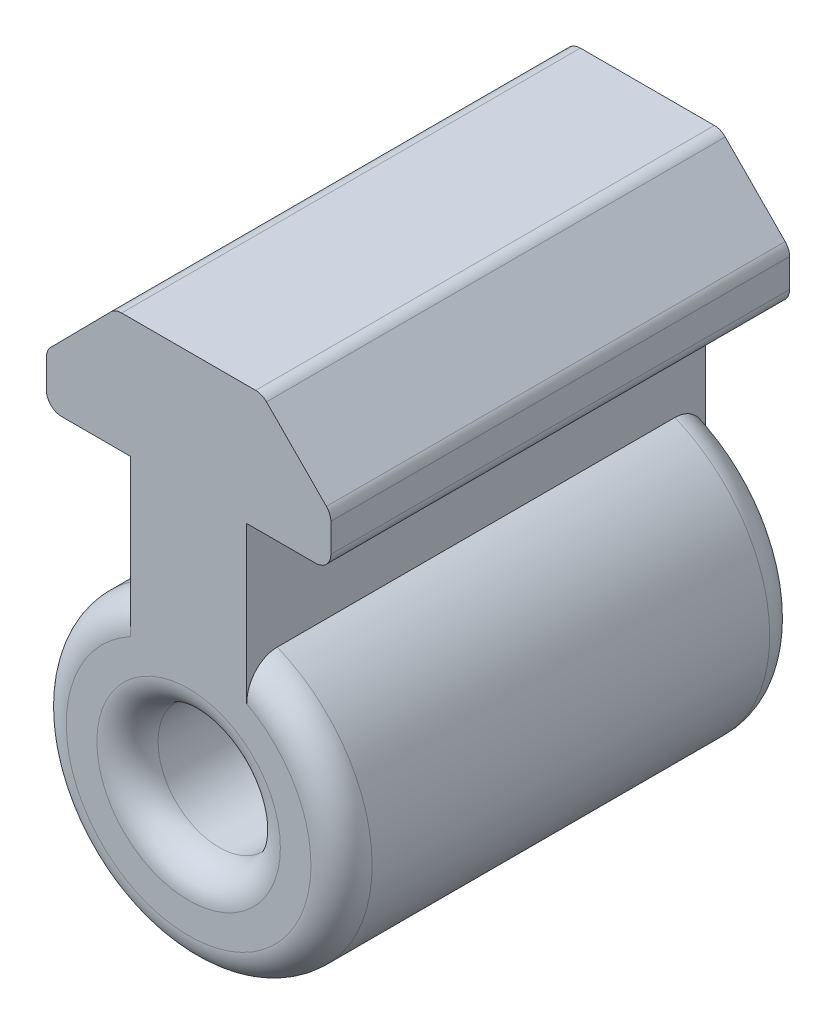
ISO-10303-21;
HEADER;
FILE_DESCRIPTION(('STEP AP214'),'2;1');
FILE_NAME('part.step','',(''),(''),'','','');
FILE_SCHEMA(('AUTOMOTIVE_DESIGN { 1 0 10303 214 1 1 1 1 }'));
ENDSEC;
DATA;
#1=APPLICATION_CONTEXT('core data for automotive mechanical design processes');
#2=APPLICATION_PROTOCOL_DEFINITION('international standard','automotive_design',2000,#1);
#3=PRODUCT_CONTEXT('',#1,'mechanical');
#4=PRODUCT('Part','Part','',(#3));
#5=PRODUCT_RELATED_PRODUCT_CATEGORY('part','',(#4));
#6=PRODUCT_DEFINITION_FORMATION('','',#4);
#7=PRODUCT_DEFINITION_CONTEXT('part definition',#1,'design');
#8=PRODUCT_DEFINITION('design','',#6,#7);
#9=PRODUCT_DEFINITION_SHAPE('','',#8);
#10=(LENGTH_UNIT() NAMED_UNIT(*) SI_UNIT(.MILLI.,.METRE.));
#11=(NAMED_UNIT(*) PLANE_ANGLE_UNIT() SI_UNIT($,.RADIAN.));
#12=(NAMED_UNIT(*) SI_UNIT($,.STERADIAN.) SOLID_ANGLE_UNIT());
#13=UNCERTAINTY_MEASURE_WITH_UNIT(LENGTH_MEASURE(1.E-05),#10,'distance_accuracy_value','');
#14=(GEOMETRIC_REPRESENTATION_CONTEXT(3) GLOBAL_UNCERTAINTY_ASSIGNED_CONTEXT((#13)) GLOBAL_UNIT_ASSIGNED_CONTEXT((#10,
#11,#12)) REPRESENTATION_CONTEXT('',''));
#15=CARTESIAN_POINT('',(0.,0.,0.));
#16=DIRECTION('',(0.,0.,1.));
#17=DIRECTION('',(1.,0.,0.));
#18=AXIS2_PLACEMENT_3D('',#15,#16,#17);
#19=CARTESIAN_POINT('',(9.3,11.28,30.));
#20=DIRECTION('',(-0.711066265811422,-0.703125,0.));
#21=DIRECTION('',(0.703125,-0.711066265811422,0.));
#22=AXIS2_PLACEMENT_3D('',#19,#20,#21);
#23=PLANE('',#22);
#24=DIRECTION('',(-0.703125,0.711066265811422,0.));
#25=VECTOR('',#24,1.);
#26=CARTESIAN_POINT('',(9.3,11.28,30.));
#27=LINE('',#26,#25);
#28=CARTESIAN_POINT('',(9.01106626581142,11.5721970224874,30.));
#29=VERTEX_POINT('',#28);
#30=CARTESIAN_POINT('',(5.09355946753683,15.5339491011931,30.));
#31=VERTEX_POINT('',#30);
#32=EDGE_CURVE('E221',#29,#31,#27,.T.);
#33=ORIENTED_EDGE('',*,*,#32,.F.);
#34=DIRECTION('',(0.,0.,-1.));
#35=VECTOR('',#34,1.);
#36=CARTESIAN_POINT('',(9.01106626581142,11.5721970224874,30.));
#37=LINE('',#36,#35);
#38=CARTESIAN_POINT('',(9.01106626581142,11.5721970224874,0.));
#39=VERTEX_POINT('',#38);
#40=EDGE_CURVE('E272',#29,#39,#37,.T.);
#41=ORIENTED_EDGE('',*,*,#40,.T.);
#42=DIRECTION('',(-0.703125,0.711066265811422,0.));
#43=VECTOR('',#42,1.);
#44=CARTESIAN_POINT('',(9.3,11.28,0.));
#45=LINE('',#44,#43);
#46=CARTESIAN_POINT('',(5.09355946753683,15.5339491011931,0.));
#47=VERTEX_POINT('',#46);
#48=EDGE_CURVE('E198',#39,#47,#45,.T.);
#49=ORIENTED_EDGE('',*,*,#48,.T.);
#50=DIRECTION('',(0.,0.,-1.));
#51=VECTOR('',#50,1.);
#52=CARTESIAN_POINT('',(5.09355946753683,15.5339491011931,30.));
#53=LINE('',#52,#51);
#54=EDGE_CURVE('E270',#47,#31,#53,.F.);
#55=ORIENTED_EDGE('',*,*,#54,.T.);
#56=EDGE_LOOP('',(#33,#41,#49,#55));
#57=FACE_BOUND('',#56,.T.);
#58=ADVANCED_FACE('F33',(#57),#23,.F.);
#59=CARTESIAN_POINT('',(-4.8,15.8308241011931,30.));
#60=DIRECTION('',(0.,-1.,0.));
#61=DIRECTION('',(0.,0.,-1.));
#62=AXIS2_PLACEMENT_3D('',#59,#60,#61);
#63=PLANE('',#62);
#64=DIRECTION('',(-1.,0.,0.));
#65=VECTOR('',#64,1.);
#66=CARTESIAN_POINT('',(-4.8,15.8308241011931,0.));
#67=LINE('',#66,#65);
#68=CARTESIAN_POINT('',(4.3824932017254,15.8308241011931,0.));
#69=VERTEX_POINT('',#68);
#70=CARTESIAN_POINT('',(-4.3824932017254,15.8308241011931,0.));
#71=VERTEX_POINT('',#70);
#72=EDGE_CURVE('E201',#69,#71,#67,.T.);
#73=ORIENTED_EDGE('',*,*,#72,.T.);
#74=DIRECTION('',(0.,0.,-1.));
#75=VECTOR('',#74,1.);
#76=CARTESIAN_POINT('',(-4.3824932017254,15.8308241011931,30.));
#77=LINE('',#76,#75);
#78=CARTESIAN_POINT('',(-4.3824932017254,15.8308241011931,30.));
#79=VERTEX_POINT('',#78);
#80=EDGE_CURVE('E278',#71,#79,#77,.F.);
#81=ORIENTED_EDGE('',*,*,#80,.T.);
#82=DIRECTION('',(-1.,0.,0.));
#83=VECTOR('',#82,1.);
#84=CARTESIAN_POINT('',(-4.8,15.8308241011931,30.));
#85=LINE('',#84,#83);
#86=CARTESIAN_POINT('',(4.3824932017254,15.8308241011931,30.));
#87=VERTEX_POINT('',#86);
#88=EDGE_CURVE('E408',#87,#79,#85,.T.);
#89=ORIENTED_EDGE('',*,*,#88,.F.);
#90=DIRECTION('',(0.,0.,-1.));
#91=VECTOR('',#90,1.);
#92=CARTESIAN_POINT('',(4.3824932017254,15.8308241011931,30.));
#93=LINE('',#92,#91);
#94=EDGE_CURVE('E275',#87,#69,#93,.T.);
#95=ORIENTED_EDGE('',*,*,#94,.T.);
#96=EDGE_LOOP('',(#73,#81,#89,#95));
#97=FACE_BOUND('',#96,.T.);
#98=ADVANCED_FACE('F366',(#97),#63,.F.);
#99=CARTESIAN_POINT('',(-9.3,11.28,30.));
#100=DIRECTION('',(0.711066265811422,-0.703125,0.));
#101=DIRECTION('',(0.703125,0.711066265811422,0.));
#102=AXIS2_PLACEMENT_3D('',#99,#100,#101);
#103=PLANE('',#102);
#104=DIRECTION('',(-0.703125,-0.711066265811422,0.));
#105=VECTOR('',#104,1.);
#106=CARTESIAN_POINT('',(-9.3,11.28,0.));
#107=LINE('',#106,#105);
#108=CARTESIAN_POINT('',(-5.09355946753682,15.5339491011931,0.));
#109=VERTEX_POINT('',#108);
#110=CARTESIAN_POINT('',(-9.01106626581142,11.5721970224874,0.));
#111=VERTEX_POINT('',#110);
#112=EDGE_CURVE('E204',#109,#111,#107,.T.);
#113=ORIENTED_EDGE('',*,*,#112,.T.);
#114=DIRECTION('',(0.,0.,-1.));
#115=VECTOR('',#114,1.);
#116=CARTESIAN_POINT('',(-9.01106626581142,11.5721970224874,30.));
#117=LINE('',#116,#115);
#118=CARTESIAN_POINT('',(-9.01106626581142,11.5721970224874,30.));
#119=VERTEX_POINT('',#118);
#120=EDGE_CURVE('E268',#111,#119,#117,.F.);
#121=ORIENTED_EDGE('',*,*,#120,.T.);
#122=DIRECTION('',(-0.703125,-0.711066265811422,0.));
#123=VECTOR('',#122,1.);
#124=CARTESIAN_POINT('',(-9.3,11.28,30.));
#125=LINE('',#124,#123);
#126=CARTESIAN_POINT('',(-5.09355946753682,15.5339491011931,30.));
#127=VERTEX_POINT('',#126);
#128=EDGE_CURVE('E405',#127,#119,#125,.T.);
#129=ORIENTED_EDGE('',*,*,#128,.F.);
#130=DIRECTION('',(0.,0.,-1.));
#131=VECTOR('',#130,1.);
#132=CARTESIAN_POINT('',(-5.09355946753683,15.5339491011931,30.));
#133=LINE('',#132,#131);
#134=EDGE_CURVE('E265',#127,#109,#133,.T.);
#135=ORIENTED_EDGE('',*,*,#134,.T.);
#136=EDGE_LOOP('',(#113,#121,#129,#135));
#137=FACE_BOUND('',#136,.T.);
#138=ADVANCED_FACE('F372',(#137),#103,.F.);
#139=CARTESIAN_POINT('',(-9.3,8.,30.));
#140=DIRECTION('',(1.,0.,0.));
#141=DIRECTION('',(0.,0.,-1.));
#142=AXIS2_PLACEMENT_3D('',#139,#140,#141);
#143=PLANE('',#142);
#144=DIRECTION('',(0.,-1.,0.));
#145=VECTOR('',#144,1.);
#146=CARTESIAN_POINT('',(-9.3,8.,0.));
#147=LINE('',#146,#145);
#148=CARTESIAN_POINT('',(-9.3,10.8690720224874,0.));
#149=VERTEX_POINT('',#148);
#150=CARTESIAN_POINT('',(-9.3,9.,0.));
#151=VERTEX_POINT('',#150);
#152=EDGE_CURVE('E207',#149,#151,#147,.T.);
#153=ORIENTED_EDGE('',*,*,#152,.T.);
#154=DIRECTION('',(0.,0.,-1.));
#155=VECTOR('',#154,1.);
#156=CARTESIAN_POINT('',(-9.3,9.,30.));
#157=LINE('',#156,#155);
#158=CARTESIAN_POINT('',(-9.3,9.,30.));
#159=VERTEX_POINT('',#158);
#160=EDGE_CURVE('E263',#151,#159,#157,.F.);
#161=ORIENTED_EDGE('',*,*,#160,.T.);
#162=DIRECTION('',(0.,-1.,0.));
#163=VECTOR('',#162,1.);
#164=CARTESIAN_POINT('',(-9.3,8.,30.));
#165=LINE('',#164,#163);
#166=CARTESIAN_POINT('',(-9.3,10.8690720224874,30.));
#167=VERTEX_POINT('',#166);
#168=EDGE_CURVE('E171',#167,#159,#165,.T.);
#169=ORIENTED_EDGE('',*,*,#168,.F.);
#170=DIRECTION('',(0.,0.,-1.));
#171=VECTOR('',#170,1.);
#172=CARTESIAN_POINT('',(-9.3,10.8690720224874,30.));
#173=LINE('',#172,#171);
#174=EDGE_CURVE('E260',#167,#149,#173,.T.);
#175=ORIENTED_EDGE('',*,*,#174,.T.);
#176=EDGE_LOOP('',(#153,#161,#169,#175));
#177=FACE_BOUND('',#176,.T.);
#178=ADVANCED_FACE('F428',(#177),#143,.F.);
#179=CARTESIAN_POINT('',(-3.8,8.,30.));
#180=DIRECTION('',(0.,1.,0.));
#181=DIRECTION('',(0.,0.,1.));
#182=AXIS2_PLACEMENT_3D('',#179,#180,#181);
#183=PLANE('',#182);
#184=DIRECTION('',(1.,0.,0.));
#185=VECTOR('',#184,1.);
#186=CARTESIAN_POINT('',(-3.8,8.,30.));
#187=LINE('',#186,#185);
#188=CARTESIAN_POINT('',(-8.3,8.,30.));
#189=VERTEX_POINT('',#188);
#190=CARTESIAN_POINT('',(-3.8,8.,30.));
#191=VERTEX_POINT('',#190);
#192=EDGE_CURVE('E162',#189,#191,#187,.T.);
#193=ORIENTED_EDGE('',*,*,#192,.F.);
#194=DIRECTION('',(0.,0.,-1.));
#195=VECTOR('',#194,1.);
#196=CARTESIAN_POINT('',(-8.3,8.,30.));
#197=LINE('',#196,#195);
#198=CARTESIAN_POINT('',(-8.3,8.,0.));
#199=VERTEX_POINT('',#198);
#200=EDGE_CURVE('E258',#189,#199,#197,.T.);
#201=ORIENTED_EDGE('',*,*,#200,.T.);
#202=DIRECTION('',(1.,0.,0.));
#203=VECTOR('',#202,1.);
#204=CARTESIAN_POINT('',(-3.8,8.,0.));
#205=LINE('',#204,#203);
#206=CARTESIAN_POINT('',(-3.8,8.,0.));
#207=VERTEX_POINT('',#206);
#208=EDGE_CURVE('E177',#199,#207,#205,.T.);
#209=ORIENTED_EDGE('',*,*,#208,.T.);
#210=DIRECTION('',(0.,0.,-1.));
#211=VECTOR('',#210,1.);
#212=CARTESIAN_POINT('',(-3.8,8.,30.));
#213=LINE('',#212,#211);
#214=EDGE_CURVE('E174',#191,#207,#213,.T.);
#215=ORIENTED_EDGE('',*,*,#214,.F.);
#216=EDGE_LOOP('',(#193,#201,#209,#215));
#217=FACE_BOUND('',#216,.T.);
#218=ADVANCED_FACE('F175',(#217),#183,.F.);
#219=CARTESIAN_POINT('',(-3.8,0.,30.));
#220=DIRECTION('',(1.,0.,0.));
#221=DIRECTION('',(0.,0.,-1.));
#222=AXIS2_PLACEMENT_3D('',#219,#220,#221);
#223=PLANE('',#222);
#224=DIRECTION('',(0.,-1.,0.));
#225=VECTOR('',#224,1.);
#226=CARTESIAN_POINT('',(-3.8,0.,0.));
#227=LINE('',#226,#225);
#228=CARTESIAN_POINT('',(-3.8,-2.20997850115852,0.));
#229=VERTEX_POINT('',#228);
#230=EDGE_CURVE('E211',#207,#229,#227,.T.);
#231=ORIENTED_EDGE('',*,*,#230,.T.);
#232=CARTESIAN_POINT('',(-3.8,-2.20997850115852,0.));
#233=CARTESIAN_POINT('',(-3.8,-2.14180631556111,3.78530135636479E-06));
#234=CARTESIAN_POINT('',(-3.8,-2.07365856659465,0.00270107917036064));
#235=CARTESIAN_POINT('',(-3.8,-1.93777401894122,0.0135903338999585));
#236=CARTESIAN_POINT('',(-3.8,-1.87003742205381,0.0217848025059018));
#237=CARTESIAN_POINT('',(-3.8,-1.66763842960154,0.0548443568738185));
#238=CARTESIAN_POINT('',(-3.8,-1.53424103894104,0.0881870904298514));
#239=CARTESIAN_POINT('',(-3.8,-1.27490950012809,0.177803231871022));
#240=CARTESIAN_POINT('',(-3.8,-1.14899972370978,0.234147277592619));
#241=CARTESIAN_POINT('',(-3.8,-0.909942324347125,0.369131935297298));
#242=CARTESIAN_POINT('',(-3.8,-0.796769413695321,0.447727238016861));
#243=CARTESIAN_POINT('',(-3.8,-0.597286446431262,0.617561395768396));
#244=CARTESIAN_POINT('',(-3.8,-0.50947904206912,0.707040435797109));
#245=CARTESIAN_POINT('',(-3.8,-0.35201401297918,0.900874288664059));
#246=CARTESIAN_POINT('',(-3.8,-0.282356842585371,1.00522947377864));
#247=CARTESIAN_POINT('',(-3.8,-0.170099255795776,1.21496879551261));
#248=CARTESIAN_POINT('',(-3.8,-0.125562265873889,1.31932113645865));
#249=CARTESIAN_POINT('',(-3.8,-0.0559882182608551,1.53423505310488));
#250=CARTESIAN_POINT('',(-3.8,-0.0309130783549708,1.64478404637224));
#251=CARTESIAN_POINT('',(-3.8,-0.010723160325956,1.79691727826258));
#252=CARTESIAN_POINT('',(-3.8,-0.00670150044098127,1.83746245571264));
#253=CARTESIAN_POINT('',(-3.8,-0.00134335203055399,1.91866499278047));
#254=CARTESIAN_POINT('',(-3.8,-2.59357248636996E-06,1.95932207056232));
#255=CARTESIAN_POINT('',(-3.8,1.2588492323583E-13,1.99999999999998));
#256=B_SPLINE_CURVE_WITH_KNOTS('',3,(#232,#233,#234,#235,#236,#237,#238,#239,#240,#241,#242,
#243,#244,#245,#246,#247,#248,#249,#250,#251,#252,#253,#254,#255),.UNSPECIFIED.,.F.,.F.,(4,2,2,
2,2,2,2,2,2,2,2,4),(0.,0.204409022436608,0.408911357292845,0.819262335870335,1.23088311218818,
1.64167167819471,2.01571544607206,2.38976857605876,2.7284260965036,3.06641926218807,
3.18858415819038,3.31055432390406),.UNSPECIFIED.);
#257=CARTESIAN_POINT('',(-3.8,0.,2.));
#258=VERTEX_POINT('',#257);
#259=EDGE_CURVE('E301',#229,#258,#256,.T.);
#260=ORIENTED_EDGE('',*,*,#259,.T.);
#261=DIRECTION('',(0.,0.,-1.));
#262=VECTOR('',#261,1.);
#263=CARTESIAN_POINT('',(-3.8,0.,30.));
#264=LINE('',#263,#262);
#265=CARTESIAN_POINT('',(-3.8,0.,28.));
#266=VERTEX_POINT('',#265);
#267=EDGE_CURVE('E181',#266,#258,#264,.T.);
#268=ORIENTED_EDGE('',*,*,#267,.F.);
#269=CARTESIAN_POINT('',(-3.8,0.,28.));
#270=CARTESIAN_POINT('',(-3.8,7.4055355542104E-06,28.05302002023));
#271=CARTESIAN_POINT('',(-3.8,-0.0022791915508727,28.1060364829993));
#272=CARTESIAN_POINT('',(-3.8,-0.0113835122208144,28.2116700512409));
#273=CARTESIAN_POINT('',(-3.8,-0.0182004562315361,28.264287223847));
#274=CARTESIAN_POINT('',(-3.8,-0.0362858128587528,28.3686168598504));
#275=CARTESIAN_POINT('',(-3.8,-0.047542964964545,28.4203312689062));
#276=CARTESIAN_POINT('',(-3.8,-0.0743880762721912,28.5226090997578));
#277=CARTESIAN_POINT('',(-3.8,-0.0899760827437128,28.5731725089843));
#278=CARTESIAN_POINT('',(-3.8,-0.143032524874081,28.7225933904034));
#279=CARTESIAN_POINT('',(-3.8,-0.186812352789468,28.8192894918659));
#280=CARTESIAN_POINT('',(-3.8,-0.289567947123572,29.0041771210286));
#281=CARTESIAN_POINT('',(-3.8,-0.348548764835901,29.0923658082991));
#282=CARTESIAN_POINT('',(-3.8,-0.481457468021468,29.26046382434));
#283=CARTESIAN_POINT('',(-3.8,-0.555737767814825,29.340094294534));
#284=CARTESIAN_POINT('',(-3.8,-0.715813703673905,29.486726488331));
#285=CARTESIAN_POINT('',(-3.8,-0.801610419487396,29.5537270263681));
#286=CARTESIAN_POINT('',(-3.8,-0.9886146311274,29.6783204347063));
#287=CARTESIAN_POINT('',(-3.8,-1.09048123761026,29.7349222379215));
#288=CARTESIAN_POINT('',(-3.8,-1.30173602448836,29.8319094441282));
#289=CARTESIAN_POINT('',(-3.8,-1.41113176727029,29.8722782556237));
#290=CARTESIAN_POINT('',(-3.8,-1.63448243970393,29.9365608145031));
#291=CARTESIAN_POINT('',(-3.8,-1.74843258995733,29.960491356129));
#292=CARTESIAN_POINT('',(-3.8,-1.97828250966539,29.9922108463915));
#293=CARTESIAN_POINT('',(-3.8,-2.09417671973099,30.0000398286236));
#294=CARTESIAN_POINT('',(-3.8,-2.20997850115853,30.));
#295=B_SPLINE_CURVE_WITH_KNOTS('',3,(#269,#270,#271,#272,#273,#274,#275,#276,#277,#278,#279,
#280,#281,#282,#283,#284,#285,#286,#287,#288,#289,#290,#291,#292,#293,#294),.UNSPECIFIED.,.F.,
.F.,(4,2,2,2,2,2,2,2,2,2,2,2,4),(0.,0.159004643703364,0.317981933296449,0.476558617148815,
0.635137031874817,0.951969134542793,1.26890665666909,1.59418238858403,1.91948863879426,
2.26763946984106,2.61614524162341,2.96429442902432,3.31157695525908),.UNSPECIFIED.);
#296=CARTESIAN_POINT('',(-3.8,-2.20997850115852,30.));
#297=VERTEX_POINT('',#296);
#298=EDGE_CURVE('E11',#266,#297,#295,.T.);
#299=ORIENTED_EDGE('',*,*,#298,.T.);
#300=DIRECTION('',(0.,-1.,0.));
#301=VECTOR('',#300,1.);
#302=CARTESIAN_POINT('',(-3.8,0.,30.));
#303=LINE('',#302,#301);
#304=EDGE_CURVE('E62',#191,#297,#303,.T.);
#305=ORIENTED_EDGE('',*,*,#304,.F.);
#306=ORIENTED_EDGE('',*,*,#214,.T.);
#307=EDGE_LOOP('',(#231,#260,#268,#299,#305,#306));
#308=FACE_BOUND('',#307,.T.);
#309=ADVANCED_FACE('F183',(#308),#223,.F.);
#310=CARTESIAN_POINT('',(3.8,0.,30.));
#311=DIRECTION('',(-1.,0.,0.));
#312=DIRECTION('',(0.,-1.,0.));
#313=AXIS2_PLACEMENT_3D('',#310,#311,#312);
#314=PLANE('',#313);
#315=DIRECTION('',(0.,1.,0.));
#316=VECTOR('',#315,1.);
#317=CARTESIAN_POINT('',(3.8,0.,0.));
#318=LINE('',#317,#316);
#319=CARTESIAN_POINT('',(3.8,-2.20997850115852,0.));
#320=VERTEX_POINT('',#319);
#321=CARTESIAN_POINT('',(3.8,8.,0.));
#322=VERTEX_POINT('',#321);
#323=EDGE_CURVE('E213',#320,#322,#318,.T.);
#324=ORIENTED_EDGE('',*,*,#323,.T.);
#325=DIRECTION('',(0.,0.,-1.));
#326=VECTOR('',#325,1.);
#327=CARTESIAN_POINT('',(3.8,8.,30.));
#328=LINE('',#327,#326);
#329=CARTESIAN_POINT('',(3.8,8.,30.));
#330=VERTEX_POINT('',#329);
#331=EDGE_CURVE('E197',#330,#322,#328,.T.);
#332=ORIENTED_EDGE('',*,*,#331,.F.);
#333=DIRECTION('',(0.,1.,0.));
#334=VECTOR('',#333,1.);
#335=CARTESIAN_POINT('',(3.8,0.,30.));
#336=LINE('',#335,#334);
#337=CARTESIAN_POINT('',(3.8,-2.20997850115852,30.));
#338=VERTEX_POINT('',#337);
#339=EDGE_CURVE('E54',#338,#330,#336,.T.);
#340=ORIENTED_EDGE('',*,*,#339,.F.);
#341=CARTESIAN_POINT('',(3.8,-2.20997850115852,30.));
#342=CARTESIAN_POINT('',(3.8,-2.14180631556111,29.9999962146986));
#343=CARTESIAN_POINT('',(3.8,-2.07365856659466,29.9972989208296));
#344=CARTESIAN_POINT('',(3.8,-1.93777401894122,29.9864096661));
#345=CARTESIAN_POINT('',(3.8,-1.87003742205381,29.9782151974941));
#346=CARTESIAN_POINT('',(3.8,-1.66763842960154,29.9451556431262));
#347=CARTESIAN_POINT('',(3.8,-1.53424103894104,29.9118129095701));
#348=CARTESIAN_POINT('',(3.8,-1.27490950012809,29.822196768129));
#349=CARTESIAN_POINT('',(3.8,-1.14899972370978,29.7658527224074));
#350=CARTESIAN_POINT('',(3.8,-0.909942324347128,29.6308680647027));
#351=CARTESIAN_POINT('',(3.8,-0.796769413695325,29.5522727619831));
#352=CARTESIAN_POINT('',(3.8,-0.597286446431265,29.3824386042316));
#353=CARTESIAN_POINT('',(3.8,-0.509479042069121,29.2929595642029));
#354=CARTESIAN_POINT('',(3.8,-0.352014012979181,29.0991257113359));
#355=CARTESIAN_POINT('',(3.8,-0.282356842585374,28.9947705262214));
#356=CARTESIAN_POINT('',(3.8,-0.170099255795779,28.7850312044874));
#357=CARTESIAN_POINT('',(3.8,-0.12556226587389,28.6806788635413));
#358=CARTESIAN_POINT('',(3.8,-0.0559882182608554,28.4657649468951));
#359=CARTESIAN_POINT('',(3.8,-0.0309130783549723,28.3552159536278));
#360=CARTESIAN_POINT('',(3.8,-0.0107231603259571,28.2030827217374));
#361=CARTESIAN_POINT('',(3.8,-0.00670150044098206,28.1625375442874));
#362=CARTESIAN_POINT('',(3.8,-0.00134335203055433,28.0813350072195));
#363=CARTESIAN_POINT('',(3.8,-2.59357248663565E-06,28.0406779294377));
#364=CARTESIAN_POINT('',(3.8,1.25148076122841E-13,28.));
#365=B_SPLINE_CURVE_WITH_KNOTS('',3,(#341,#342,#343,#344,#345,#346,#347,#348,#349,#350,#351,
#352,#353,#354,#355,#356,#357,#358,#359,#360,#361,#362,#363,#364),.UNSPECIFIED.,.F.,.F.,(4,2,2,
2,2,2,2,2,2,2,2,4),(0.,0.204409022436607,0.408911357292844,0.819262335870334,1.23088311218817,
1.64167167819471,2.01571544607206,2.38976857605876,2.7284260965036,3.06641926218807,
3.18858415819038,3.31055432390406),.UNSPECIFIED.);
#366=CARTESIAN_POINT('',(3.8,0.,28.));
#367=VERTEX_POINT('',#366);
#368=EDGE_CURVE('E47',#338,#367,#365,.T.);
#369=ORIENTED_EDGE('',*,*,#368,.T.);
#370=DIRECTION('',(0.,0.,-1.));
#371=VECTOR('',#370,1.);
#372=CARTESIAN_POINT('',(3.8,0.,30.));
#373=LINE('',#372,#371);
#374=CARTESIAN_POINT('',(3.8,0.,2.));
#375=VERTEX_POINT('',#374);
#376=EDGE_CURVE('E224',#367,#375,#373,.T.);
#377=ORIENTED_EDGE('',*,*,#376,.T.);
#378=CARTESIAN_POINT('',(3.8,0.,2.));
#379=CARTESIAN_POINT('',(3.8,7.40553555121832E-06,1.94697997976996));
#380=CARTESIAN_POINT('',(3.8,-0.00227919155087597,1.89396351700068));
#381=CARTESIAN_POINT('',(3.8,-0.0113835122208169,1.78832994875906));
#382=CARTESIAN_POINT('',(3.8,-0.0182004562315376,1.73571277615296));
#383=CARTESIAN_POINT('',(3.8,-0.0362858128587547,1.63138314014963));
#384=CARTESIAN_POINT('',(3.8,-0.0475429649645482,1.57966873109378));
#385=CARTESIAN_POINT('',(3.8,-0.0743880762721941,1.47739090024221));
#386=CARTESIAN_POINT('',(3.8,-0.0899760827437141,1.42682749101574));
#387=CARTESIAN_POINT('',(3.8,-0.14303252487408,1.27740660959661));
#388=CARTESIAN_POINT('',(3.8,-0.186812352789468,1.18071050813411));
#389=CARTESIAN_POINT('',(3.8,-0.289567947123574,0.995822878971418));
#390=CARTESIAN_POINT('',(3.8,-0.348548764835904,0.907634191700849));
#391=CARTESIAN_POINT('',(3.8,-0.481457468021471,0.739536175660006));
#392=CARTESIAN_POINT('',(3.8,-0.555737767814828,0.659905705466039));
#393=CARTESIAN_POINT('',(3.8,-0.71581370367391,0.513273511668996));
#394=CARTESIAN_POINT('',(3.8,-0.801610419487401,0.446272973631848));
#395=CARTESIAN_POINT('',(3.8,-0.988614631127407,0.321679565293686));
#396=CARTESIAN_POINT('',(3.8,-1.09048123761027,0.265077762078534));
#397=CARTESIAN_POINT('',(3.8,-1.30173602448836,0.168090555871815));
#398=CARTESIAN_POINT('',(3.8,-1.4111317672703,0.127721744376262));
#399=CARTESIAN_POINT('',(3.8,-1.63448243970394,0.0634391854968892));
#400=CARTESIAN_POINT('',(3.8,-1.74843258995734,0.039508643871022));
#401=CARTESIAN_POINT('',(3.8,-1.97828250966539,0.00778915360853473));
#402=CARTESIAN_POINT('',(3.8,-2.09417671973099,-3.9828623585774E-05));
#403=CARTESIAN_POINT('',(3.8,-2.20997850115853,0.));
#404=B_SPLINE_CURVE_WITH_KNOTS('',3,(#378,#379,#380,#381,#382,#383,#384,#385,#386,#387,#388,
#389,#390,#391,#392,#393,#394,#395,#396,#397,#398,#399,#400,#401,#402,#403),.UNSPECIFIED.,.F.,
.F.,(4,2,2,2,2,2,2,2,2,2,2,2,4),(0.,0.159004643703367,0.317981933296455,0.476558617148821,
0.635137031874818,0.951969134542794,1.26890665666909,1.59418238858403,1.91948863879426,
2.26763946984106,2.61614524162341,2.96429442902432,3.31157695525908),.UNSPECIFIED.);
#405=EDGE_CURVE('E308',#375,#320,#404,.T.);
#406=ORIENTED_EDGE('',*,*,#405,.T.);
#407=EDGE_LOOP('',(#324,#332,#340,#369,#377,#406));
#408=FACE_BOUND('',#407,.T.);
#409=ADVANCED_FACE('F335',(#408),#314,.F.);
#410=CARTESIAN_POINT('',(3.8,8.,30.));
#411=DIRECTION('',(0.,1.,0.));
#412=DIRECTION('',(0.,0.,1.));
#413=AXIS2_PLACEMENT_3D('',#410,#411,#412);
#414=PLANE('',#413);
#415=DIRECTION('',(1.,0.,0.));
#416=VECTOR('',#415,1.);
#417=CARTESIAN_POINT('',(3.8,8.,0.));
#418=LINE('',#417,#416);
#419=CARTESIAN_POINT('',(8.3,8.,0.));
#420=VERTEX_POINT('',#419);
#421=EDGE_CURVE('E215',#322,#420,#418,.T.);
#422=ORIENTED_EDGE('',*,*,#421,.T.);
#423=DIRECTION('',(0.,0.,-1.));
#424=VECTOR('',#423,1.);
#425=CARTESIAN_POINT('',(8.3,8.,30.));
#426=LINE('',#425,#424);
#427=CARTESIAN_POINT('',(8.3,8.,30.));
#428=VERTEX_POINT('',#427);
#429=EDGE_CURVE('E245',#420,#428,#426,.F.);
#430=ORIENTED_EDGE('',*,*,#429,.T.);
#431=DIRECTION('',(1.,0.,0.));
#432=VECTOR('',#431,1.);
#433=CARTESIAN_POINT('',(3.8,8.,30.));
#434=LINE('',#433,#432);
#435=EDGE_CURVE('E188',#330,#428,#434,.T.);
#436=ORIENTED_EDGE('',*,*,#435,.F.);
#437=ORIENTED_EDGE('',*,*,#331,.T.);
#438=EDGE_LOOP('',(#422,#430,#436,#437));
#439=FACE_BOUND('',#438,.T.);
#440=ADVANCED_FACE('F339',(#439),#414,.F.);
#441=CARTESIAN_POINT('',(9.3,8.,30.));
#442=DIRECTION('',(-1.,0.,0.));
#443=DIRECTION('',(0.,0.,1.));
#444=AXIS2_PLACEMENT_3D('',#441,#442,#443);
#445=PLANE('',#444);
#446=DIRECTION('',(0.,1.,0.));
#447=VECTOR('',#446,1.);
#448=CARTESIAN_POINT('',(9.3,8.,30.));
#449=LINE('',#448,#447);
#450=CARTESIAN_POINT('',(9.3,9.,30.));
#451=VERTEX_POINT('',#450);
#452=CARTESIAN_POINT('',(9.3,10.8690720224874,30.));
#453=VERTEX_POINT('',#452);
#454=EDGE_CURVE('E194',#451,#453,#449,.T.);
#455=ORIENTED_EDGE('',*,*,#454,.F.);
#456=DIRECTION('',(0.,0.,-1.));
#457=VECTOR('',#456,1.);
#458=CARTESIAN_POINT('',(9.3,9.,30.));
#459=LINE('',#458,#457);
#460=CARTESIAN_POINT('',(9.3,9.,0.));
#461=VERTEX_POINT('',#460);
#462=EDGE_CURVE('E230',#451,#461,#459,.T.);
#463=ORIENTED_EDGE('',*,*,#462,.T.);
#464=DIRECTION('',(0.,1.,0.));
#465=VECTOR('',#464,1.);
#466=CARTESIAN_POINT('',(9.3,8.,0.));
#467=LINE('',#466,#465);
#468=CARTESIAN_POINT('',(9.3,10.8690720224874,0.));
#469=VERTEX_POINT('',#468);
#470=EDGE_CURVE('E218',#461,#469,#467,.T.);
#471=ORIENTED_EDGE('',*,*,#470,.T.);
#472=DIRECTION('',(0.,0.,-1.));
#473=VECTOR('',#472,1.);
#474=CARTESIAN_POINT('',(9.3,10.8690720224874,30.));
#475=LINE('',#474,#473);
#476=EDGE_CURVE('E180',#469,#453,#475,.F.);
#477=ORIENTED_EDGE('',*,*,#476,.T.);
#478=EDGE_LOOP('',(#455,#463,#471,#477));
#479=FACE_BOUND('',#478,.T.);
#480=ADVANCED_FACE('F343',(#479),#445,.F.);
#481=CARTESIAN_POINT('',(0.,0.,30.));
#482=DIRECTION('',(0.,0.,-1.));
#483=DIRECTION('',(-1.,0.,0.));
#484=AXIS2_PLACEMENT_3D('',#481,#482,#483);
#485=PLANE('',#484);
#486=CARTESIAN_POINT('',(0.,-9.24986486387774,30.));
#487=DIRECTION('',(0.,0.,-1.));
#488=DIRECTION('',(-1.,0.,0.));
#489=AXIS2_PLACEMENT_3D('',#486,#487,#488);
#490=CIRCLE('',#489,6.);
#491=CARTESIAN_POINT('',(-6.,-9.24986486387774,30.));
#492=VERTEX_POINT('',#491);
#493=EDGE_CURVE('E290',#492,#492,#490,.T.);
#494=ORIENTED_EDGE('',*,*,#493,.T.);
#495=EDGE_LOOP('',(#494));
#496=FACE_BOUND('',#495,.T.);
#497=CARTESIAN_POINT('',(0.,-9.24986486387774,30.));
#498=DIRECTION('',(0.,0.,-1.));
#499=DIRECTION('',(-1.,0.,0.));
#500=AXIS2_PLACEMENT_3D('',#497,#498,#499);
#501=CIRCLE('',#500,8.);
#502=EDGE_CURVE('E293',#297,#338,#501,.F.);
#503=ORIENTED_EDGE('',*,*,#502,.T.);
#504=ORIENTED_EDGE('',*,*,#339,.T.);
#505=ORIENTED_EDGE('',*,*,#435,.T.);
#506=CARTESIAN_POINT('',(8.3,9.,30.));
#507=DIRECTION('',(0.,0.,-1.));
#508=DIRECTION('',(-1.,0.,0.));
#509=AXIS2_PLACEMENT_3D('',#506,#507,#508);
#510=CIRCLE('',#509,1.);
#511=EDGE_CURVE('E256',#428,#451,#510,.F.);
#512=ORIENTED_EDGE('',*,*,#511,.T.);
#513=ORIENTED_EDGE('',*,*,#454,.T.);
#514=CARTESIAN_POINT('',(8.3,10.8690720224874,30.));
#515=DIRECTION('',(0.,0.,-1.));
#516=DIRECTION('',(-1.,0.,0.));
#517=AXIS2_PLACEMENT_3D('',#514,#515,#516);
#518=CIRCLE('',#517,1.);
#519=EDGE_CURVE('E251',#453,#29,#518,.F.);
#520=ORIENTED_EDGE('',*,*,#519,.T.);
#521=ORIENTED_EDGE('',*,*,#32,.T.);
#522=CARTESIAN_POINT('',(4.3824932017254,14.8308241011931,30.));
#523=DIRECTION('',(0.,0.,-1.));
#524=DIRECTION('',(-1.,0.,0.));
#525=AXIS2_PLACEMENT_3D('',#522,#523,#524);
#526=CIRCLE('',#525,1.);
#527=EDGE_CURVE('E247',#31,#87,#526,.F.);
#528=ORIENTED_EDGE('',*,*,#527,.T.);
#529=ORIENTED_EDGE('',*,*,#88,.T.);
#530=CARTESIAN_POINT('',(-4.3824932017254,14.8308241011931,30.));
#531=DIRECTION('',(0.,0.,-1.));
#532=DIRECTION('',(-1.,0.,0.));
#533=AXIS2_PLACEMENT_3D('',#530,#531,#532);
#534=CIRCLE('',#533,1.);
#535=EDGE_CURVE('E249',#79,#127,#534,.F.);
#536=ORIENTED_EDGE('',*,*,#535,.T.);
#537=ORIENTED_EDGE('',*,*,#128,.T.);
#538=CARTESIAN_POINT('',(-8.3,10.8690720224874,30.));
#539=DIRECTION('',(0.,0.,-1.));
#540=DIRECTION('',(-1.,0.,0.));
#541=AXIS2_PLACEMENT_3D('',#538,#539,#540);
#542=CIRCLE('',#541,1.);
#543=EDGE_CURVE('E253',#119,#167,#542,.F.);
#544=ORIENTED_EDGE('',*,*,#543,.T.);
#545=ORIENTED_EDGE('',*,*,#168,.T.);
#546=CARTESIAN_POINT('',(-8.3,9.,30.));
#547=DIRECTION('',(0.,0.,-1.));
#548=DIRECTION('',(-1.,0.,0.));
#549=AXIS2_PLACEMENT_3D('',#546,#547,#548);
#550=CIRCLE('',#549,1.);
#551=EDGE_CURVE('E167',#159,#189,#550,.F.);
#552=ORIENTED_EDGE('',*,*,#551,.T.);
#553=ORIENTED_EDGE('',*,*,#192,.T.);
#554=ORIENTED_EDGE('',*,*,#304,.T.);
#555=EDGE_LOOP('',(#503,#504,#505,#512,#513,#520,#521,#528,#529,#536,#537,#544,#545,#552,#553,#554));
#556=FACE_BOUND('',#555,.T.);
#557=ADVANCED_FACE('F164',(#496,#556),#485,.F.);
#558=CARTESIAN_POINT('',(0.,0.,0.));
#559=DIRECTION('',(0.,0.,-1.));
#560=DIRECTION('',(-1.,0.,0.));
#561=AXIS2_PLACEMENT_3D('',#558,#559,#560);
#562=PLANE('',#561);
#563=CARTESIAN_POINT('',(0.,-9.24986486387774,0.));
#564=DIRECTION('',(0.,0.,-1.));
#565=DIRECTION('',(-1.,0.,0.));
#566=AXIS2_PLACEMENT_3D('',#563,#564,#565);
#567=CIRCLE('',#566,6.);
#568=CARTESIAN_POINT('',(-6.,-9.24986486387774,0.));
#569=VERTEX_POINT('',#568);
#570=EDGE_CURVE('E280',#569,#569,#567,.F.);
#571=ORIENTED_EDGE('',*,*,#570,.T.);
#572=EDGE_LOOP('',(#571));
#573=FACE_BOUND('',#572,.T.);
#574=CARTESIAN_POINT('',(0.,-9.24986486387774,0.));
#575=DIRECTION('',(0.,0.,-1.));
#576=DIRECTION('',(-1.,0.,0.));
#577=AXIS2_PLACEMENT_3D('',#574,#575,#576);
#578=CIRCLE('',#577,8.);
#579=EDGE_CURVE('E283',#320,#229,#578,.T.);
#580=ORIENTED_EDGE('',*,*,#579,.T.);
#581=ORIENTED_EDGE('',*,*,#230,.F.);
#582=ORIENTED_EDGE('',*,*,#208,.F.);
#583=CARTESIAN_POINT('',(-8.3,9.,0.));
#584=DIRECTION('',(0.,0.,-1.));
#585=DIRECTION('',(-1.,0.,0.));
#586=AXIS2_PLACEMENT_3D('',#583,#584,#585);
#587=CIRCLE('',#586,1.);
#588=EDGE_CURVE('E241',#199,#151,#587,.T.);
#589=ORIENTED_EDGE('',*,*,#588,.T.);
#590=ORIENTED_EDGE('',*,*,#152,.F.);
#591=CARTESIAN_POINT('',(-8.3,10.8690720224874,0.));
#592=DIRECTION('',(0.,0.,-1.));
#593=DIRECTION('',(-1.,0.,0.));
#594=AXIS2_PLACEMENT_3D('',#591,#592,#593);
#595=CIRCLE('',#594,1.);
#596=EDGE_CURVE('E239',#149,#111,#595,.T.);
#597=ORIENTED_EDGE('',*,*,#596,.T.);
#598=ORIENTED_EDGE('',*,*,#112,.F.);
#599=CARTESIAN_POINT('',(-4.3824932017254,14.8308241011931,0.));
#600=DIRECTION('',(0.,0.,-1.));
#601=DIRECTION('',(-1.,0.,0.));
#602=AXIS2_PLACEMENT_3D('',#599,#600,#601);
#603=CIRCLE('',#602,1.);
#604=EDGE_CURVE('E235',#109,#71,#603,.T.);
#605=ORIENTED_EDGE('',*,*,#604,.T.);
#606=ORIENTED_EDGE('',*,*,#72,.F.);
#607=CARTESIAN_POINT('',(4.3824932017254,14.8308241011931,0.));
#608=DIRECTION('',(0.,0.,-1.));
#609=DIRECTION('',(-1.,0.,0.));
#610=AXIS2_PLACEMENT_3D('',#607,#608,#609);
#611=CIRCLE('',#610,1.);
#612=EDGE_CURVE('E233',#69,#47,#611,.T.);
#613=ORIENTED_EDGE('',*,*,#612,.T.);
#614=ORIENTED_EDGE('',*,*,#48,.F.);
#615=CARTESIAN_POINT('',(8.3,10.8690720224874,0.));
#616=DIRECTION('',(0.,0.,-1.));
#617=DIRECTION('',(-1.,0.,0.));
#618=AXIS2_PLACEMENT_3D('',#615,#616,#617);
#619=CIRCLE('',#618,1.);
#620=EDGE_CURVE('E237',#39,#469,#619,.T.);
#621=ORIENTED_EDGE('',*,*,#620,.T.);
#622=ORIENTED_EDGE('',*,*,#470,.F.);
#623=CARTESIAN_POINT('',(8.3,9.,0.));
#624=DIRECTION('',(0.,0.,-1.));
#625=DIRECTION('',(-1.,0.,0.));
#626=AXIS2_PLACEMENT_3D('',#623,#624,#625);
#627=CIRCLE('',#626,1.);
#628=EDGE_CURVE('E243',#461,#420,#627,.T.);
#629=ORIENTED_EDGE('',*,*,#628,.T.);
#630=ORIENTED_EDGE('',*,*,#421,.F.);
#631=ORIENTED_EDGE('',*,*,#323,.F.);
#632=EDGE_LOOP('',(#580,#581,#582,#589,#590,#597,#598,#605,#606,#613,#614,#621,#622,#629,#630,#631));
#633=FACE_BOUND('',#632,.T.);
#634=ADVANCED_FACE('F348',(#573,#633),#562,.T.);
#635=CARTESIAN_POINT('',(8.3,9.,30.));
#636=DIRECTION('',(0.,0.,-1.));
#637=DIRECTION('',(-1.,0.,0.));
#638=AXIS2_PLACEMENT_3D('',#635,#636,#637);
#639=CYLINDRICAL_SURFACE('',#638,1.);
#640=ORIENTED_EDGE('',*,*,#511,.F.);
#641=ORIENTED_EDGE('',*,*,#429,.F.);
#642=ORIENTED_EDGE('',*,*,#628,.F.);
#643=ORIENTED_EDGE('',*,*,#462,.F.);
#644=EDGE_LOOP('',(#640,#641,#642,#643));
#645=FACE_BOUND('',#644,.T.);
#646=ADVANCED_FACE('F351',(#645),#639,.T.);
#647=CARTESIAN_POINT('',(-8.3,9.,30.));
#648=DIRECTION('',(0.,0.,-1.));
#649=DIRECTION('',(-1.,0.,0.));
#650=AXIS2_PLACEMENT_3D('',#647,#648,#649);
#651=CYLINDRICAL_SURFACE('',#650,1.);
#652=ORIENTED_EDGE('',*,*,#551,.F.);
#653=ORIENTED_EDGE('',*,*,#160,.F.);
#654=ORIENTED_EDGE('',*,*,#588,.F.);
#655=ORIENTED_EDGE('',*,*,#200,.F.);
#656=EDGE_LOOP('',(#652,#653,#654,#655));
#657=FACE_BOUND('',#656,.T.);
#658=ADVANCED_FACE('F380',(#657),#651,.T.);
#659=CARTESIAN_POINT('',(-8.3,10.8690720224874,30.));
#660=DIRECTION('',(0.,0.,-1.));
#661=DIRECTION('',(-1.,0.,0.));
#662=AXIS2_PLACEMENT_3D('',#659,#660,#661);
#663=CYLINDRICAL_SURFACE('',#662,1.);
#664=ORIENTED_EDGE('',*,*,#543,.F.);
#665=ORIENTED_EDGE('',*,*,#120,.F.);
#666=ORIENTED_EDGE('',*,*,#596,.F.);
#667=ORIENTED_EDGE('',*,*,#174,.F.);
#668=EDGE_LOOP('',(#664,#665,#666,#667));
#669=FACE_BOUND('',#668,.T.);
#670=ADVANCED_FACE('F384',(#669),#663,.T.);
#671=CARTESIAN_POINT('',(8.3,10.8690720224874,30.));
#672=DIRECTION('',(0.,0.,-1.));
#673=DIRECTION('',(-1.,0.,0.));
#674=AXIS2_PLACEMENT_3D('',#671,#672,#673);
#675=CYLINDRICAL_SURFACE('',#674,1.);
#676=ORIENTED_EDGE('',*,*,#519,.F.);
#677=ORIENTED_EDGE('',*,*,#476,.F.);
#678=ORIENTED_EDGE('',*,*,#620,.F.);
#679=ORIENTED_EDGE('',*,*,#40,.F.);
#680=EDGE_LOOP('',(#676,#677,#678,#679));
#681=FACE_BOUND('',#680,.T.);
#682=ADVANCED_FACE('F388',(#681),#675,.T.);
#683=CARTESIAN_POINT('',(-4.3824932017254,14.8308241011931,30.));
#684=DIRECTION('',(0.,0.,-1.));
#685=DIRECTION('',(-1.,0.,0.));
#686=AXIS2_PLACEMENT_3D('',#683,#684,#685);
#687=CYLINDRICAL_SURFACE('',#686,1.);
#688=ORIENTED_EDGE('',*,*,#535,.F.);
#689=ORIENTED_EDGE('',*,*,#80,.F.);
#690=ORIENTED_EDGE('',*,*,#604,.F.);
#691=ORIENTED_EDGE('',*,*,#134,.F.);
#692=EDGE_LOOP('',(#688,#689,#690,#691));
#693=FACE_BOUND('',#692,.T.);
#694=ADVANCED_FACE('F391',(#693),#687,.T.);
#695=CARTESIAN_POINT('',(4.3824932017254,14.8308241011931,30.));
#696=DIRECTION('',(0.,0.,-1.));
#697=DIRECTION('',(-1.,0.,0.));
#698=AXIS2_PLACEMENT_3D('',#695,#696,#697);
#699=CYLINDRICAL_SURFACE('',#698,1.);
#700=ORIENTED_EDGE('',*,*,#527,.F.);
#701=ORIENTED_EDGE('',*,*,#54,.F.);
#702=ORIENTED_EDGE('',*,*,#612,.F.);
#703=ORIENTED_EDGE('',*,*,#94,.F.);
#704=EDGE_LOOP('',(#700,#701,#702,#703));
#705=FACE_BOUND('',#704,.T.);
#706=ADVANCED_FACE('F323',(#705),#699,.T.);
#707=CARTESIAN_POINT('',(0.,-9.24986486387774,58.2842712474619));
#708=DIRECTION('',(0.,0.,-1.));
#709=DIRECTION('',(-1.,0.,0.));
#710=AXIS2_PLACEMENT_3D('',#707,#708,#709);
#711=CYLINDRICAL_SURFACE('',#710,10.);
#712=ORIENTED_EDGE('',*,*,#267,.T.);
#713=CARTESIAN_POINT('',(0.,-9.24986486387774,2.));
#714=DIRECTION('',(0.,0.,-1.));
#715=DIRECTION('',(-1.,0.,0.));
#716=AXIS2_PLACEMENT_3D('',#713,#714,#715);
#717=CIRCLE('',#716,10.);
#718=EDGE_CURVE('E288',#258,#375,#717,.F.);
#719=ORIENTED_EDGE('',*,*,#718,.T.);
#720=ORIENTED_EDGE('',*,*,#376,.F.);
#721=CARTESIAN_POINT('',(0.,-9.24986486387774,28.));
#722=DIRECTION('',(0.,0.,-1.));
#723=DIRECTION('',(-1.,0.,0.));
#724=AXIS2_PLACEMENT_3D('',#721,#722,#723);
#725=CIRCLE('',#724,10.);
#726=EDGE_CURVE('E286',#367,#266,#725,.T.);
#727=ORIENTED_EDGE('',*,*,#726,.T.);
#728=EDGE_LOOP('',(#712,#719,#720,#727));
#729=FACE_BOUND('',#728,.T.);
#730=ADVANCED_FACE('F356',(#729),#711,.T.);
#731=CARTESIAN_POINT('',(0.,-9.24986486387774,58.2842712474619));
#732=DIRECTION('',(0.,0.,-1.));
#733=DIRECTION('',(-1.,0.,0.));
#734=AXIS2_PLACEMENT_3D('',#731,#732,#733);
#735=CYLINDRICAL_SURFACE('',#734,4.);
#736=CARTESIAN_POINT('',(0.,-9.24986486387774,28.));
#737=DIRECTION('',(0.,0.,-1.));
#738=DIRECTION('',(-1.,0.,0.));
#739=AXIS2_PLACEMENT_3D('',#736,#737,#738);
#740=CIRCLE('',#739,4.);
#741=CARTESIAN_POINT('',(-4.,-9.24986486387774,28.));
#742=VERTEX_POINT('',#741);
#743=EDGE_CURVE('E298',#742,#742,#740,.F.);
#744=CARTESIAN_POINT('',(0.,-9.24986486387774,2.00000000000001));
#745=DIRECTION('',(0.,0.,-1.));
#746=DIRECTION('',(-1.,0.,0.));
#747=AXIS2_PLACEMENT_3D('',#744,#745,#746);
#748=CIRCLE('',#747,4.);
#749=CARTESIAN_POINT('',(-4.,-9.24986486387774,2.00000000000001));
#750=VERTEX_POINT('',#749);
#751=EDGE_CURVE('E295',#750,#750,#748,.T.);
#752=CARTESIAN_POINT('',(-4.,-9.24986486387774,28.));
#753=CARTESIAN_POINT('',(-4.,-9.24986486387774,27.7291666666667));
#754=CARTESIAN_POINT('',(-4.,-9.24986486387774,27.4583333333333));
#755=CARTESIAN_POINT('',(-4.,-9.24986486387774,26.9166666666667));
#756=CARTESIAN_POINT('',(-4.,-9.24986486387774,26.6458333333333));
#757=CARTESIAN_POINT('',(-4.,-9.24986486387774,26.1041666666667));
#758=CARTESIAN_POINT('',(-4.,-9.24986486387774,25.8333333333333));
#759=CARTESIAN_POINT('',(-4.,-9.24986486387774,25.2916666666667));
#760=CARTESIAN_POINT('',(-4.,-9.24986486387774,25.0208333333333));
#761=CARTESIAN_POINT('',(-4.,-9.24986486387774,24.4791666666667));
#762=CARTESIAN_POINT('',(-4.,-9.24986486387774,24.2083333333333));
#763=CARTESIAN_POINT('',(-4.,-9.24986486387774,23.6666666666667));
#764=CARTESIAN_POINT('',(-4.,-9.24986486387774,23.3958333333333));
#765=CARTESIAN_POINT('',(-4.,-9.24986486387774,22.8541666666667));
#766=CARTESIAN_POINT('',(-4.,-9.24986486387774,22.5833333333333));
#767=CARTESIAN_POINT('',(-4.,-9.24986486387774,22.0416666666667));
#768=CARTESIAN_POINT('',(-4.,-9.24986486387774,21.7708333333333));
#769=CARTESIAN_POINT('',(-4.,-9.24986486387774,21.2291666666667));
#770=CARTESIAN_POINT('',(-4.,-9.24986486387774,20.9583333333333));
#771=CARTESIAN_POINT('',(-4.,-9.24986486387774,20.4166666666667));
#772=CARTESIAN_POINT('',(-4.,-9.24986486387774,20.1458333333333));
#773=CARTESIAN_POINT('',(-4.,-9.24986486387774,19.6041666666667));
#774=CARTESIAN_POINT('',(-4.,-9.24986486387774,19.3333333333333));
#775=CARTESIAN_POINT('',(-4.,-9.24986486387774,18.7916666666667));
#776=CARTESIAN_POINT('',(-4.,-9.24986486387774,18.5208333333333));
#777=CARTESIAN_POINT('',(-4.,-9.24986486387774,17.9791666666667));
#778=CARTESIAN_POINT('',(-4.,-9.24986486387774,17.7083333333333));
#779=CARTESIAN_POINT('',(-4.,-9.24986486387774,17.1666666666667));
#780=CARTESIAN_POINT('',(-4.,-9.24986486387774,16.8958333333333));
#781=CARTESIAN_POINT('',(-4.,-9.24986486387774,16.3541666666667));
#782=CARTESIAN_POINT('',(-4.,-9.24986486387774,16.0833333333333));
#783=CARTESIAN_POINT('',(-4.,-9.24986486387774,15.5416666666667));
#784=CARTESIAN_POINT('',(-4.,-9.24986486387774,15.2708333333333));
#785=CARTESIAN_POINT('',(-4.,-9.24986486387774,14.7291666666667));
#786=CARTESIAN_POINT('',(-4.,-9.24986486387774,14.4583333333333));
#787=CARTESIAN_POINT('',(-4.,-9.24986486387774,13.9166666666667));
#788=CARTESIAN_POINT('',(-4.,-9.24986486387774,13.6458333333333));
#789=CARTESIAN_POINT('',(-4.,-9.24986486387774,13.1041666666667));
#790=CARTESIAN_POINT('',(-4.,-9.24986486387774,12.8333333333333));
#791=CARTESIAN_POINT('',(-4.,-9.24986486387774,12.2916666666667));
#792=CARTESIAN_POINT('',(-4.,-9.24986486387774,12.0208333333333));
#793=CARTESIAN_POINT('',(-4.,-9.24986486387774,11.4791666666667));
#794=CARTESIAN_POINT('',(-4.,-9.24986486387774,11.2083333333333));
#795=CARTESIAN_POINT('',(-4.,-9.24986486387774,10.6666666666667));
#796=CARTESIAN_POINT('',(-4.,-9.24986486387774,10.3958333333333));
#797=CARTESIAN_POINT('',(-4.,-9.24986486387774,9.85416666666668));
#798=CARTESIAN_POINT('',(-4.,-9.24986486387774,9.58333333333334));
#799=CARTESIAN_POINT('',(-4.,-9.24986486387774,9.04166666666667));
#800=CARTESIAN_POINT('',(-4.,-9.24986486387774,8.77083333333334));
#801=CARTESIAN_POINT('',(-4.,-9.24986486387774,8.22916666666667));
#802=CARTESIAN_POINT('',(-4.,-9.24986486387774,7.95833333333334));
#803=CARTESIAN_POINT('',(-4.,-9.24986486387774,7.41666666666667));
#804=CARTESIAN_POINT('',(-4.,-9.24986486387774,7.14583333333334));
#805=CARTESIAN_POINT('',(-4.,-9.24986486387774,6.60416666666667));
#806=CARTESIAN_POINT('',(-4.,-9.24986486387774,6.33333333333334));
#807=CARTESIAN_POINT('',(-4.,-9.24986486387774,5.79166666666667));
#808=CARTESIAN_POINT('',(-4.,-9.24986486387774,5.52083333333334));
#809=CARTESIAN_POINT('',(-4.,-9.24986486387774,4.97916666666668));
#810=CARTESIAN_POINT('',(-4.,-9.24986486387774,4.70833333333334));
#811=CARTESIAN_POINT('',(-4.,-9.24986486387774,4.16666666666667));
#812=CARTESIAN_POINT('',(-4.,-9.24986486387774,3.89583333333334));
#813=CARTESIAN_POINT('',(-4.,-9.24986486387774,3.35416666666668));
#814=CARTESIAN_POINT('',(-4.,-9.24986486387774,3.08333333333334));
#815=CARTESIAN_POINT('',(-4.,-9.24986486387774,2.54166666666668));
#816=CARTESIAN_POINT('',(-4.,-9.24986486387774,2.27083333333334));
#817=CARTESIAN_POINT('',(-4.,-9.24986486387774,2.00000000000001));
#818=B_SPLINE_CURVE_WITH_KNOTS('',3,(#752,#753,#754,#755,#756,#757,#758,#759,#760,#761,#762,
#763,#764,#765,#766,#767,#768,#769,#770,#771,#772,#773,#774,#775,#776,#777,#778,#779,#780,#781,
#782,#783,#784,#785,#786,#787,#788,#789,#790,#791,#792,#793,#794,#795,#796,#797,#798,#799,#800,
#801,#802,#803,#804,#805,#806,#807,#808,#809,#810,#811,#812,#813,#814,#815,#816,#817),
.UNSPECIFIED.,.F.,.F.,(4,2,2,2,2,2,2,2,2,2,2,2,2,2,2,2,2,2,2,2,2,2,2,2,2,2,2,2,2,2,2,2,4),(0.,
0.812500000000001,1.625,2.4375,3.25,4.06249999999999,4.87499999999999,5.68749999999999,6.5,
7.3125,8.125,8.9375,9.74999999999999,10.5625,11.375,12.1875,13.,13.8125,14.625,15.4375,16.25,
17.0625,17.875,18.6875,19.5,20.3125,21.125,21.9375,22.75,23.5625,24.375,25.1875,26.),.UNSPECIFIED.);
#819=EDGE_CURVE('BSEAM321',#742,#750,#818,.T.);
#820=ORIENTED_EDGE('',*,*,#743,.T.);
#821=ORIENTED_EDGE('',*,*,#751,.T.);
#822=ORIENTED_EDGE('',*,*,#819,.T.);
#823=ORIENTED_EDGE('',*,*,#819,.F.);
#824=EDGE_LOOP('',(#820,#822,#821,#823));
#825=FACE_BOUND('',#824,.T.);
#826=ADVANCED_FACE('F321',(#825),#735,.F.);
#827=CARTESIAN_POINT('',(0.,-9.24986486387774,2.));
#828=DIRECTION('',(0.,0.,-1.));
#829=DIRECTION('',(-1.,0.,0.));
#830=AXIS2_PLACEMENT_3D('',#827,#828,#829);
#831=TOROIDAL_SURFACE('',#830,8.,2.);
#832=ORIENTED_EDGE('',*,*,#405,.F.);
#833=ORIENTED_EDGE('',*,*,#718,.F.);
#834=ORIENTED_EDGE('',*,*,#259,.F.);
#835=ORIENTED_EDGE('',*,*,#579,.F.);
#836=EDGE_LOOP('',(#832,#833,#834,#835));
#837=FACE_BOUND('',#836,.T.);
#838=ADVANCED_FACE('F316',(#837),#831,.T.);
#839=CARTESIAN_POINT('',(0.,-9.24986486387774,28.));
#840=DIRECTION('',(0.,0.,-1.));
#841=DIRECTION('',(-1.,0.,0.));
#842=AXIS2_PLACEMENT_3D('',#839,#840,#841);
#843=TOROIDAL_SURFACE('',#842,8.,2.);
#844=ORIENTED_EDGE('',*,*,#298,.F.);
#845=ORIENTED_EDGE('',*,*,#726,.F.);
#846=ORIENTED_EDGE('',*,*,#368,.F.);
#847=ORIENTED_EDGE('',*,*,#502,.F.);
#848=EDGE_LOOP('',(#844,#845,#846,#847));
#849=FACE_BOUND('',#848,.T.);
#850=ADVANCED_FACE('F320',(#849),#843,.T.);
#851=CARTESIAN_POINT('',(0.,-9.24986486387774,28.));
#852=DIRECTION('',(0.,0.,-1.));
#853=DIRECTION('',(-1.,0.,0.));
#854=AXIS2_PLACEMENT_3D('',#851,#852,#853);
#855=TOROIDAL_SURFACE('',#854,6.,2.);
#856=ORIENTED_EDGE('',*,*,#493,.F.);
#857=EDGE_LOOP('',(#856));
#858=FACE_BOUND('',#857,.T.);
#859=ORIENTED_EDGE('',*,*,#743,.F.);
#860=EDGE_LOOP('',(#859));
#861=FACE_BOUND('',#860,.T.);
#862=ADVANCED_FACE('F328',(#858,#861),#855,.T.);
#863=CARTESIAN_POINT('',(0.,-9.24986486387774,2.));
#864=DIRECTION('',(0.,0.,-1.));
#865=DIRECTION('',(-1.,0.,0.));
#866=AXIS2_PLACEMENT_3D('',#863,#864,#865);
#867=TOROIDAL_SURFACE('',#866,6.,2.);
#868=ORIENTED_EDGE('',*,*,#570,.F.);
#869=EDGE_LOOP('',(#868));
#870=FACE_BOUND('',#869,.T.);
#871=ORIENTED_EDGE('',*,*,#751,.F.);
#872=EDGE_LOOP('',(#871));
#873=FACE_BOUND('',#872,.T.);
#874=ADVANCED_FACE('F35',(#870,#873),#867,.T.);
#875=CLOSED_SHELL('',(#58,#98,#138,#178,#218,#309,#409,#440,#480,#557,#634,#646,#658,#670,#682,
#694,#706,#730,#826,#838,#850,#862,#874));
#876=MANIFOLD_SOLID_BREP('B2',#875);
#877=ADVANCED_BREP_SHAPE_REPRESENTATION('',(#18,#876),#14);
#878=SHAPE_DEFINITION_REPRESENTATION(#9,#877);
ENDSEC;
END-ISO-10303-21;
